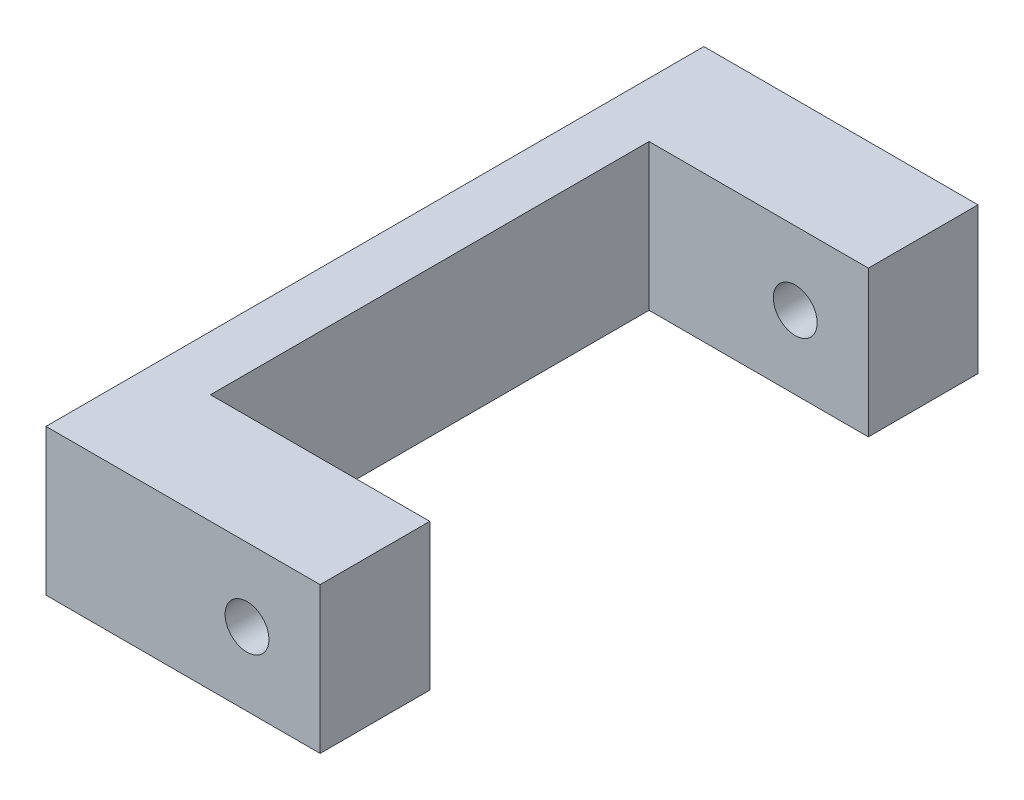
ISO-10303-21;
HEADER;
FILE_DESCRIPTION(('STEP AP214'),'2;1');
FILE_NAME('part.step','',(''),(''),'','','');
FILE_SCHEMA(('AUTOMOTIVE_DESIGN { 1 0 10303 214 1 1 1 1 }'));
ENDSEC;
DATA;
#1=APPLICATION_CONTEXT('core data for automotive mechanical design processes');
#2=APPLICATION_PROTOCOL_DEFINITION('international standard','automotive_design',2000,#1);
#3=PRODUCT_CONTEXT('',#1,'mechanical');
#4=PRODUCT('Part','Part','',(#3));
#5=PRODUCT_RELATED_PRODUCT_CATEGORY('part','',(#4));
#6=PRODUCT_DEFINITION_FORMATION('','',#4);
#7=PRODUCT_DEFINITION_CONTEXT('part definition',#1,'design');
#8=PRODUCT_DEFINITION('design','',#6,#7);
#9=PRODUCT_DEFINITION_SHAPE('','',#8);
#10=(LENGTH_UNIT() NAMED_UNIT(*) SI_UNIT(.MILLI.,.METRE.));
#11=(NAMED_UNIT(*) PLANE_ANGLE_UNIT() SI_UNIT($,.RADIAN.));
#12=(NAMED_UNIT(*) SI_UNIT($,.STERADIAN.) SOLID_ANGLE_UNIT());
#13=UNCERTAINTY_MEASURE_WITH_UNIT(LENGTH_MEASURE(1.E-05),#10,'distance_accuracy_value','');
#14=(GEOMETRIC_REPRESENTATION_CONTEXT(3) GLOBAL_UNCERTAINTY_ASSIGNED_CONTEXT((#13)) GLOBAL_UNIT_ASSIGNED_CONTEXT((#10,
#11,#12)) REPRESENTATION_CONTEXT('',''));
#15=CARTESIAN_POINT('',(0.,0.,0.));
#16=DIRECTION('',(0.,0.,1.));
#17=DIRECTION('',(1.,0.,0.));
#18=AXIS2_PLACEMENT_3D('',#15,#16,#17);
#19=CARTESIAN_POINT('',(-15.,-20.,0.));
#20=DIRECTION('',(0.,-1.,0.));
#21=DIRECTION('',(0.,0.,-1.));
#22=AXIS2_PLACEMENT_3D('',#19,#20,#21);
#23=PLANE('',#22);
#24=DIRECTION('',(0.,0.,-1.));
#25=VECTOR('',#24,1.);
#26=CARTESIAN_POINT('',(0.,-20.,0.));
#27=LINE('',#26,#25);
#28=CARTESIAN_POINT('',(0.,-20.,60.));
#29=VERTEX_POINT('',#28);
#30=CARTESIAN_POINT('',(0.,-20.,-60.));
#31=VERTEX_POINT('',#30);
#32=EDGE_CURVE('E158',#29,#31,#27,.T.);
#33=ORIENTED_EDGE('',*,*,#32,.F.);
#34=DIRECTION('',(-1.,0.,0.));
#35=VECTOR('',#34,1.);
#36=CARTESIAN_POINT('',(60.,-20.,60.));
#37=LINE('',#36,#35);
#38=CARTESIAN_POINT('',(60.,-20.,60.));
#39=VERTEX_POINT('',#38);
#40=EDGE_CURVE('E156',#39,#29,#37,.T.);
#41=ORIENTED_EDGE('',*,*,#40,.F.);
#42=DIRECTION('',(0.,0.,-1.));
#43=VECTOR('',#42,1.);
#44=CARTESIAN_POINT('',(60.,-20.,0.));
#45=LINE('',#44,#43);
#46=CARTESIAN_POINT('',(60.,-20.,90.));
#47=VERTEX_POINT('',#46);
#48=EDGE_CURVE('E135',#47,#39,#45,.T.);
#49=ORIENTED_EDGE('',*,*,#48,.F.);
#50=DIRECTION('',(1.,0.,0.));
#51=VECTOR('',#50,1.);
#52=CARTESIAN_POINT('',(-15.,-20.,90.));
#53=LINE('',#52,#51);
#54=CARTESIAN_POINT('',(-15.,-20.,90.));
#55=VERTEX_POINT('',#54);
#56=EDGE_CURVE('E11',#55,#47,#53,.T.);
#57=ORIENTED_EDGE('',*,*,#56,.F.);
#58=DIRECTION('',(0.,0.,-1.));
#59=VECTOR('',#58,1.);
#60=CARTESIAN_POINT('',(-15.,-20.,0.));
#61=LINE('',#60,#59);
#62=CARTESIAN_POINT('',(-15.,-20.,-90.));
#63=VERTEX_POINT('',#62);
#64=EDGE_CURVE('E149',#55,#63,#61,.T.);
#65=ORIENTED_EDGE('',*,*,#64,.T.);
#66=DIRECTION('',(1.,0.,0.));
#67=VECTOR('',#66,1.);
#68=CARTESIAN_POINT('',(-15.,-20.,-90.));
#69=LINE('',#68,#67);
#70=CARTESIAN_POINT('',(60.,-20.,-90.));
#71=VERTEX_POINT('',#70);
#72=EDGE_CURVE('E117',#63,#71,#69,.T.);
#73=ORIENTED_EDGE('',*,*,#72,.T.);
#74=DIRECTION('',(0.,0.,-1.));
#75=VECTOR('',#74,1.);
#76=CARTESIAN_POINT('',(60.,-20.,0.));
#77=LINE('',#76,#75);
#78=CARTESIAN_POINT('',(60.,-20.,-60.));
#79=VERTEX_POINT('',#78);
#80=EDGE_CURVE('E116',#79,#71,#77,.T.);
#81=ORIENTED_EDGE('',*,*,#80,.F.);
#82=DIRECTION('',(-1.,0.,0.));
#83=VECTOR('',#82,1.);
#84=CARTESIAN_POINT('',(60.,-20.,-60.));
#85=LINE('',#84,#83);
#86=EDGE_CURVE('E105',#79,#31,#85,.T.);
#87=ORIENTED_EDGE('',*,*,#86,.T.);
#88=EDGE_LOOP('',(#33,#41,#49,#57,#65,#73,#81,#87));
#89=FACE_BOUND('',#88,.T.);
#90=ADVANCED_FACE('F39',(#89),#23,.T.);
#91=CARTESIAN_POINT('',(-15.,0.,90.));
#92=DIRECTION('',(0.,0.,-1.));
#93=DIRECTION('',(-1.,0.,0.));
#94=AXIS2_PLACEMENT_3D('',#91,#92,#93);
#95=PLANE('',#94);
#96=CARTESIAN_POINT('',(40.,0.,90.));
#97=DIRECTION('',(0.,0.,-1.));
#98=DIRECTION('',(-1.,0.,0.));
#99=AXIS2_PLACEMENT_3D('',#96,#97,#98);
#100=CIRCLE('',#99,6.);
#101=CARTESIAN_POINT('',(34.,0.,90.));
#102=VERTEX_POINT('',#101);
#103=EDGE_CURVE('E243',#102,#102,#100,.T.);
#104=ORIENTED_EDGE('',*,*,#103,.T.);
#105=EDGE_LOOP('',(#104));
#106=FACE_BOUND('',#105,.T.);
#107=ORIENTED_EDGE('',*,*,#56,.T.);
#108=DIRECTION('',(0.,1.,0.));
#109=VECTOR('',#108,1.);
#110=CARTESIAN_POINT('',(60.,0.,90.));
#111=LINE('',#110,#109);
#112=CARTESIAN_POINT('',(60.,20.,90.));
#113=VERTEX_POINT('',#112);
#114=EDGE_CURVE('E143',#47,#113,#111,.T.);
#115=ORIENTED_EDGE('',*,*,#114,.T.);
#116=DIRECTION('',(1.,0.,0.));
#117=VECTOR('',#116,1.);
#118=CARTESIAN_POINT('',(-15.,20.,90.));
#119=LINE('',#118,#117);
#120=CARTESIAN_POINT('',(-15.,20.,90.));
#121=VERTEX_POINT('',#120);
#122=EDGE_CURVE('E47',#121,#113,#119,.T.);
#123=ORIENTED_EDGE('',*,*,#122,.F.);
#124=DIRECTION('',(0.,1.,0.));
#125=VECTOR('',#124,1.);
#126=CARTESIAN_POINT('',(-15.,0.,90.));
#127=LINE('',#126,#125);
#128=EDGE_CURVE('E178',#55,#121,#127,.T.);
#129=ORIENTED_EDGE('',*,*,#128,.F.);
#130=EDGE_LOOP('',(#107,#115,#123,#129));
#131=FACE_BOUND('',#130,.T.);
#132=ADVANCED_FACE('F201',(#106,#131),#95,.F.);
#133=CARTESIAN_POINT('',(-15.,20.,0.));
#134=DIRECTION('',(0.,-1.,0.));
#135=DIRECTION('',(0.,0.,-1.));
#136=AXIS2_PLACEMENT_3D('',#133,#134,#135);
#137=PLANE('',#136);
#138=ORIENTED_EDGE('',*,*,#122,.T.);
#139=DIRECTION('',(0.,0.,-1.));
#140=VECTOR('',#139,1.);
#141=CARTESIAN_POINT('',(60.,20.,0.));
#142=LINE('',#141,#140);
#143=CARTESIAN_POINT('',(60.,20.,60.));
#144=VERTEX_POINT('',#143);
#145=EDGE_CURVE('E140',#113,#144,#142,.T.);
#146=ORIENTED_EDGE('',*,*,#145,.T.);
#147=DIRECTION('',(-1.,0.,0.));
#148=VECTOR('',#147,1.);
#149=CARTESIAN_POINT('',(60.,20.,60.));
#150=LINE('',#149,#148);
#151=CARTESIAN_POINT('',(0.,20.,60.));
#152=VERTEX_POINT('',#151);
#153=EDGE_CURVE('E146',#144,#152,#150,.T.);
#154=ORIENTED_EDGE('',*,*,#153,.T.);
#155=DIRECTION('',(0.,0.,-1.));
#156=VECTOR('',#155,1.);
#157=CARTESIAN_POINT('',(0.,20.,0.));
#158=LINE('',#157,#156);
#159=CARTESIAN_POINT('',(0.,20.,-60.));
#160=VERTEX_POINT('',#159);
#161=EDGE_CURVE('E162',#152,#160,#158,.T.);
#162=ORIENTED_EDGE('',*,*,#161,.T.);
#163=DIRECTION('',(-1.,0.,0.));
#164=VECTOR('',#163,1.);
#165=CARTESIAN_POINT('',(60.,20.,-60.));
#166=LINE('',#165,#164);
#167=CARTESIAN_POINT('',(60.,20.,-60.));
#168=VERTEX_POINT('',#167);
#169=EDGE_CURVE('E113',#168,#160,#166,.T.);
#170=ORIENTED_EDGE('',*,*,#169,.F.);
#171=DIRECTION('',(0.,0.,-1.));
#172=VECTOR('',#171,1.);
#173=CARTESIAN_POINT('',(60.,20.,0.));
#174=LINE('',#173,#172);
#175=CARTESIAN_POINT('',(60.,20.,-90.));
#176=VERTEX_POINT('',#175);
#177=EDGE_CURVE('E125',#168,#176,#174,.T.);
#178=ORIENTED_EDGE('',*,*,#177,.T.);
#179=DIRECTION('',(1.,0.,0.));
#180=VECTOR('',#179,1.);
#181=CARTESIAN_POINT('',(-15.,20.,-90.));
#182=LINE('',#181,#180);
#183=CARTESIAN_POINT('',(-15.,20.,-90.));
#184=VERTEX_POINT('',#183);
#185=EDGE_CURVE('E177',#184,#176,#182,.T.);
#186=ORIENTED_EDGE('',*,*,#185,.F.);
#187=DIRECTION('',(0.,0.,-1.));
#188=VECTOR('',#187,1.);
#189=CARTESIAN_POINT('',(-15.,20.,0.));
#190=LINE('',#189,#188);
#191=EDGE_CURVE('E179',#121,#184,#190,.T.);
#192=ORIENTED_EDGE('',*,*,#191,.F.);
#193=EDGE_LOOP('',(#138,#146,#154,#162,#170,#178,#186,#192));
#194=FACE_BOUND('',#193,.T.);
#195=ADVANCED_FACE('F191',(#194),#137,.F.);
#196=CARTESIAN_POINT('',(-15.,0.,-90.));
#197=DIRECTION('',(0.,0.,-1.));
#198=DIRECTION('',(0.,1.,0.));
#199=AXIS2_PLACEMENT_3D('',#196,#197,#198);
#200=PLANE('',#199);
#201=CARTESIAN_POINT('',(40.,0.,-90.));
#202=DIRECTION('',(0.,0.,-1.));
#203=DIRECTION('',(-1.,0.,0.));
#204=AXIS2_PLACEMENT_3D('',#201,#202,#203);
#205=CIRCLE('',#204,6.);
#206=CARTESIAN_POINT('',(34.,0.,-90.));
#207=VERTEX_POINT('',#206);
#208=EDGE_CURVE('E242',#207,#207,#205,.T.);
#209=ORIENTED_EDGE('',*,*,#208,.F.);
#210=EDGE_LOOP('',(#209));
#211=FACE_BOUND('',#210,.T.);
#212=ORIENTED_EDGE('',*,*,#185,.T.);
#213=DIRECTION('',(0.,1.,0.));
#214=VECTOR('',#213,1.);
#215=CARTESIAN_POINT('',(60.,0.,-90.));
#216=LINE('',#215,#214);
#217=EDGE_CURVE('E121',#71,#176,#216,.T.);
#218=ORIENTED_EDGE('',*,*,#217,.F.);
#219=ORIENTED_EDGE('',*,*,#72,.F.);
#220=DIRECTION('',(0.,1.,0.));
#221=VECTOR('',#220,1.);
#222=CARTESIAN_POINT('',(-15.,0.,-90.));
#223=LINE('',#222,#221);
#224=EDGE_CURVE('E183',#63,#184,#223,.T.);
#225=ORIENTED_EDGE('',*,*,#224,.T.);
#226=EDGE_LOOP('',(#212,#218,#219,#225));
#227=FACE_BOUND('',#226,.T.);
#228=ADVANCED_FACE('F192',(#211,#227),#200,.T.);
#229=CARTESIAN_POINT('',(-15.,0.,0.));
#230=DIRECTION('',(1.,0.,0.));
#231=DIRECTION('',(0.,0.,-1.));
#232=AXIS2_PLACEMENT_3D('',#229,#230,#231);
#233=PLANE('',#232);
#234=ORIENTED_EDGE('',*,*,#64,.F.);
#235=ORIENTED_EDGE('',*,*,#128,.T.);
#236=ORIENTED_EDGE('',*,*,#191,.T.);
#237=ORIENTED_EDGE('',*,*,#224,.F.);
#238=EDGE_LOOP('',(#234,#235,#236,#237));
#239=FACE_BOUND('',#238,.T.);
#240=ADVANCED_FACE('F188',(#239),#233,.F.);
#241=CARTESIAN_POINT('',(0.,0.,0.));
#242=DIRECTION('',(1.,0.,0.));
#243=DIRECTION('',(0.,0.,-1.));
#244=AXIS2_PLACEMENT_3D('',#241,#242,#243);
#245=PLANE('',#244);
#246=DIRECTION('',(0.,1.,0.));
#247=VECTOR('',#246,1.);
#248=CARTESIAN_POINT('',(0.,0.,-60.));
#249=LINE('',#248,#247);
#250=EDGE_CURVE('E112',#31,#160,#249,.T.);
#251=ORIENTED_EDGE('',*,*,#250,.T.);
#252=ORIENTED_EDGE('',*,*,#161,.F.);
#253=DIRECTION('',(0.,1.,0.));
#254=VECTOR('',#253,1.);
#255=CARTESIAN_POINT('',(0.,0.,60.));
#256=LINE('',#255,#254);
#257=EDGE_CURVE('E55',#29,#152,#256,.T.);
#258=ORIENTED_EDGE('',*,*,#257,.F.);
#259=ORIENTED_EDGE('',*,*,#32,.T.);
#260=EDGE_LOOP('',(#251,#252,#258,#259));
#261=FACE_BOUND('',#260,.T.);
#262=ADVANCED_FACE('F199',(#261),#245,.T.);
#263=CARTESIAN_POINT('',(60.,0.,60.));
#264=DIRECTION('',(0.,0.,1.));
#265=DIRECTION('',(1.,0.,0.));
#266=AXIS2_PLACEMENT_3D('',#263,#264,#265);
#267=PLANE('',#266);
#268=CARTESIAN_POINT('',(40.,0.,60.));
#269=DIRECTION('',(0.,0.,1.));
#270=DIRECTION('',(1.,0.,0.));
#271=AXIS2_PLACEMENT_3D('',#268,#269,#270);
#272=CIRCLE('',#271,6.);
#273=CARTESIAN_POINT('',(46.,0.,60.));
#274=VERTEX_POINT('',#273);
#275=EDGE_CURVE('E127',#274,#274,#272,.T.);
#276=ORIENTED_EDGE('',*,*,#275,.T.);
#277=EDGE_LOOP('',(#276));
#278=FACE_BOUND('',#277,.T.);
#279=ORIENTED_EDGE('',*,*,#257,.T.);
#280=ORIENTED_EDGE('',*,*,#153,.F.);
#281=DIRECTION('',(0.,1.,0.));
#282=VECTOR('',#281,1.);
#283=CARTESIAN_POINT('',(60.,0.,60.));
#284=LINE('',#283,#282);
#285=EDGE_CURVE('E138',#39,#144,#284,.T.);
#286=ORIENTED_EDGE('',*,*,#285,.F.);
#287=ORIENTED_EDGE('',*,*,#40,.T.);
#288=EDGE_LOOP('',(#279,#280,#286,#287));
#289=FACE_BOUND('',#288,.T.);
#290=ADVANCED_FACE('F216',(#278,#289),#267,.F.);
#291=CARTESIAN_POINT('',(60.,0.,0.));
#292=DIRECTION('',(1.,0.,0.));
#293=DIRECTION('',(0.,0.,-1.));
#294=AXIS2_PLACEMENT_3D('',#291,#292,#293);
#295=PLANE('',#294);
#296=ORIENTED_EDGE('',*,*,#48,.T.);
#297=ORIENTED_EDGE('',*,*,#285,.T.);
#298=ORIENTED_EDGE('',*,*,#145,.F.);
#299=ORIENTED_EDGE('',*,*,#114,.F.);
#300=EDGE_LOOP('',(#296,#297,#298,#299));
#301=FACE_BOUND('',#300,.T.);
#302=ADVANCED_FACE('F220',(#301),#295,.T.);
#303=CARTESIAN_POINT('',(60.,0.,-60.));
#304=DIRECTION('',(0.,0.,1.));
#305=DIRECTION('',(1.,0.,0.));
#306=AXIS2_PLACEMENT_3D('',#303,#304,#305);
#307=PLANE('',#306);
#308=CARTESIAN_POINT('',(40.,0.,-60.));
#309=DIRECTION('',(0.,0.,1.));
#310=DIRECTION('',(1.,0.,0.));
#311=AXIS2_PLACEMENT_3D('',#308,#309,#310);
#312=CIRCLE('',#311,6.);
#313=CARTESIAN_POINT('',(46.,0.,-60.));
#314=VERTEX_POINT('',#313);
#315=EDGE_CURVE('E42',#314,#314,#312,.T.);
#316=ORIENTED_EDGE('',*,*,#315,.F.);
#317=EDGE_LOOP('',(#316));
#318=FACE_BOUND('',#317,.T.);
#319=ORIENTED_EDGE('',*,*,#250,.F.);
#320=ORIENTED_EDGE('',*,*,#86,.F.);
#321=DIRECTION('',(0.,1.,0.));
#322=VECTOR('',#321,1.);
#323=CARTESIAN_POINT('',(60.,0.,-60.));
#324=LINE('',#323,#322);
#325=EDGE_CURVE('E109',#79,#168,#324,.T.);
#326=ORIENTED_EDGE('',*,*,#325,.T.);
#327=ORIENTED_EDGE('',*,*,#169,.T.);
#328=EDGE_LOOP('',(#319,#320,#326,#327));
#329=FACE_BOUND('',#328,.T.);
#330=ADVANCED_FACE('F107',(#318,#329),#307,.T.);
#331=CARTESIAN_POINT('',(60.,0.,0.));
#332=DIRECTION('',(1.,0.,0.));
#333=DIRECTION('',(0.,0.,-1.));
#334=AXIS2_PLACEMENT_3D('',#331,#332,#333);
#335=PLANE('',#334);
#336=ORIENTED_EDGE('',*,*,#325,.F.);
#337=ORIENTED_EDGE('',*,*,#80,.T.);
#338=ORIENTED_EDGE('',*,*,#217,.T.);
#339=ORIENTED_EDGE('',*,*,#177,.F.);
#340=EDGE_LOOP('',(#336,#337,#338,#339));
#341=FACE_BOUND('',#340,.T.);
#342=ADVANCED_FACE('F123',(#341),#335,.T.);
#343=CARTESIAN_POINT('',(40.,0.,90.));
#344=DIRECTION('',(0.,0.,-1.));
#345=DIRECTION('',(-1.,0.,0.));
#346=AXIS2_PLACEMENT_3D('',#343,#344,#345);
#347=CYLINDRICAL_SURFACE('',#346,6.);
#348=ORIENTED_EDGE('',*,*,#315,.T.);
#349=EDGE_LOOP('',(#348));
#350=FACE_BOUND('',#349,.T.);
#351=ORIENTED_EDGE('',*,*,#208,.T.);
#352=EDGE_LOOP('',(#351));
#353=FACE_BOUND('',#352,.T.);
#354=ADVANCED_FACE('F230',(#350,#353),#347,.F.);
#355=ORIENTED_EDGE('',*,*,#103,.F.);
#356=EDGE_LOOP('',(#355));
#357=FACE_BOUND('',#356,.T.);
#358=ORIENTED_EDGE('',*,*,#275,.F.);
#359=EDGE_LOOP('',(#358));
#360=FACE_BOUND('',#359,.T.);
#361=ADVANCED_FACE('F232',(#357,#360),#347,.F.);
#362=CLOSED_SHELL('',(#90,#132,#195,#228,#240,#262,#290,#302,#330,#342,#354,#361));
#363=MANIFOLD_SOLID_BREP('B2',#362);
#364=ADVANCED_BREP_SHAPE_REPRESENTATION('',(#18,#363),#14);
#365=SHAPE_DEFINITION_REPRESENTATION(#9,#364);
ENDSEC;
END-ISO-10303-21;
